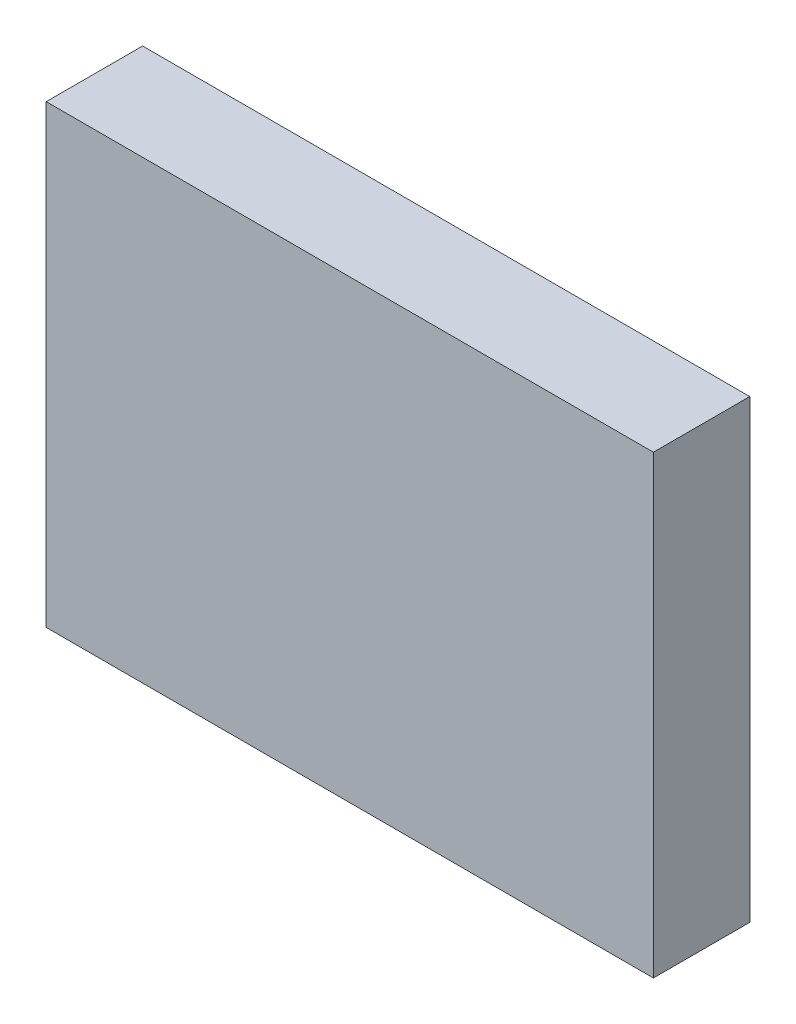
ISO-10303-21;
HEADER;
FILE_DESCRIPTION(('STEP AP214'),'2;1');
FILE_NAME('part.step','',(''),(''),'','','');
FILE_SCHEMA(('AUTOMOTIVE_DESIGN { 1 0 10303 214 1 1 1 1 }'));
ENDSEC;
DATA;
#1=APPLICATION_CONTEXT('core data for automotive mechanical design processes');
#2=APPLICATION_PROTOCOL_DEFINITION('international standard','automotive_design',2000,#1);
#3=PRODUCT_CONTEXT('',#1,'mechanical');
#4=PRODUCT('Part','Part','',(#3));
#5=PRODUCT_RELATED_PRODUCT_CATEGORY('part','',(#4));
#6=PRODUCT_DEFINITION_FORMATION('','',#4);
#7=PRODUCT_DEFINITION_CONTEXT('part definition',#1,'design');
#8=PRODUCT_DEFINITION('design','',#6,#7);
#9=PRODUCT_DEFINITION_SHAPE('','',#8);
#10=(LENGTH_UNIT() NAMED_UNIT(*) SI_UNIT(.MILLI.,.METRE.));
#11=(NAMED_UNIT(*) PLANE_ANGLE_UNIT() SI_UNIT($,.RADIAN.));
#12=(NAMED_UNIT(*) SI_UNIT($,.STERADIAN.) SOLID_ANGLE_UNIT());
#13=UNCERTAINTY_MEASURE_WITH_UNIT(LENGTH_MEASURE(1.E-05),#10,'distance_accuracy_value','');
#14=(GEOMETRIC_REPRESENTATION_CONTEXT(3) GLOBAL_UNCERTAINTY_ASSIGNED_CONTEXT((#13)) GLOBAL_UNIT_ASSIGNED_CONTEXT((#10,
#11,#12)) REPRESENTATION_CONTEXT('',''));
#15=CARTESIAN_POINT('',(0.,0.,0.));
#16=DIRECTION('',(0.,0.,1.));
#17=DIRECTION('',(1.,0.,0.));
#18=AXIS2_PLACEMENT_3D('',#15,#16,#17);
#19=CARTESIAN_POINT('',(-80.,-60.,25.4));
#20=DIRECTION('',(1.,0.,0.));
#21=DIRECTION('',(0.,0.,-1.));
#22=AXIS2_PLACEMENT_3D('',#19,#20,#21);
#23=PLANE('',#22);
#24=DIRECTION('',(0.,-1.,0.));
#25=VECTOR('',#24,1.);
#26=CARTESIAN_POINT('',(-80.,-60.,0.));
#27=LINE('',#26,#25);
#28=CARTESIAN_POINT('',(-80.,60.,0.));
#29=VERTEX_POINT('',#28);
#30=CARTESIAN_POINT('',(-80.,-60.,0.));
#31=VERTEX_POINT('',#30);
#32=EDGE_CURVE('E96',#29,#31,#27,.T.);
#33=ORIENTED_EDGE('',*,*,#32,.T.);
#34=DIRECTION('',(0.,0.,-1.));
#35=VECTOR('',#34,1.);
#36=CARTESIAN_POINT('',(-80.,-60.,25.4));
#37=LINE('',#36,#35);
#38=CARTESIAN_POINT('',(-80.,-60.,25.4));
#39=VERTEX_POINT('',#38);
#40=EDGE_CURVE('E11',#39,#31,#37,.T.);
#41=ORIENTED_EDGE('',*,*,#40,.F.);
#42=DIRECTION('',(0.,-1.,0.));
#43=VECTOR('',#42,1.);
#44=CARTESIAN_POINT('',(-80.,-60.,25.4));
#45=LINE('',#44,#43);
#46=CARTESIAN_POINT('',(-80.,60.,25.4));
#47=VERTEX_POINT('',#46);
#48=EDGE_CURVE('E84',#47,#39,#45,.T.);
#49=ORIENTED_EDGE('',*,*,#48,.F.);
#50=DIRECTION('',(0.,0.,-1.));
#51=VECTOR('',#50,1.);
#52=CARTESIAN_POINT('',(-80.,60.,25.4));
#53=LINE('',#52,#51);
#54=EDGE_CURVE('E92',#47,#29,#53,.T.);
#55=ORIENTED_EDGE('',*,*,#54,.T.);
#56=EDGE_LOOP('',(#33,#41,#49,#55));
#57=FACE_BOUND('',#56,.T.);
#58=ADVANCED_FACE('F33',(#57),#23,.F.);
#59=CARTESIAN_POINT('',(80.,-60.,25.4));
#60=DIRECTION('',(0.,1.,0.));
#61=DIRECTION('',(-1.,0.,0.));
#62=AXIS2_PLACEMENT_3D('',#59,#60,#61);
#63=PLANE('',#62);
#64=DIRECTION('',(1.,0.,0.));
#65=VECTOR('',#64,1.);
#66=CARTESIAN_POINT('',(80.,-60.,0.));
#67=LINE('',#66,#65);
#68=CARTESIAN_POINT('',(80.,-60.,0.));
#69=VERTEX_POINT('',#68);
#70=EDGE_CURVE('E88',#31,#69,#67,.T.);
#71=ORIENTED_EDGE('',*,*,#70,.T.);
#72=DIRECTION('',(0.,0.,-1.));
#73=VECTOR('',#72,1.);
#74=CARTESIAN_POINT('',(80.,-60.,25.4));
#75=LINE('',#74,#73);
#76=CARTESIAN_POINT('',(80.,-60.,25.4));
#77=VERTEX_POINT('',#76);
#78=EDGE_CURVE('E41',#77,#69,#75,.T.);
#79=ORIENTED_EDGE('',*,*,#78,.F.);
#80=DIRECTION('',(1.,0.,0.));
#81=VECTOR('',#80,1.);
#82=CARTESIAN_POINT('',(80.,-60.,25.4));
#83=LINE('',#82,#81);
#84=EDGE_CURVE('E79',#39,#77,#83,.T.);
#85=ORIENTED_EDGE('',*,*,#84,.F.);
#86=ORIENTED_EDGE('',*,*,#40,.T.);
#87=EDGE_LOOP('',(#71,#79,#85,#86));
#88=FACE_BOUND('',#87,.T.);
#89=ADVANCED_FACE('F87',(#88),#63,.F.);
#90=CARTESIAN_POINT('',(80.,-60.,25.4));
#91=DIRECTION('',(-1.,0.,0.));
#92=DIRECTION('',(0.,0.,1.));
#93=AXIS2_PLACEMENT_3D('',#90,#91,#92);
#94=PLANE('',#93);
#95=DIRECTION('',(0.,1.,0.));
#96=VECTOR('',#95,1.);
#97=CARTESIAN_POINT('',(80.,-60.,0.));
#98=LINE('',#97,#96);
#99=CARTESIAN_POINT('',(80.,60.,0.));
#100=VERTEX_POINT('',#99);
#101=EDGE_CURVE('E66',#69,#100,#98,.T.);
#102=ORIENTED_EDGE('',*,*,#101,.T.);
#103=DIRECTION('',(0.,0.,-1.));
#104=VECTOR('',#103,1.);
#105=CARTESIAN_POINT('',(80.,60.,25.4));
#106=LINE('',#105,#104);
#107=CARTESIAN_POINT('',(80.,60.,25.4));
#108=VERTEX_POINT('',#107);
#109=EDGE_CURVE('E89',#108,#100,#106,.T.);
#110=ORIENTED_EDGE('',*,*,#109,.F.);
#111=DIRECTION('',(0.,1.,0.));
#112=VECTOR('',#111,1.);
#113=CARTESIAN_POINT('',(80.,-60.,25.4));
#114=LINE('',#113,#112);
#115=EDGE_CURVE('E82',#77,#108,#114,.T.);
#116=ORIENTED_EDGE('',*,*,#115,.F.);
#117=ORIENTED_EDGE('',*,*,#78,.T.);
#118=EDGE_LOOP('',(#102,#110,#116,#117));
#119=FACE_BOUND('',#118,.T.);
#120=ADVANCED_FACE('F90',(#119),#94,.F.);
#121=CARTESIAN_POINT('',(80.,60.,25.4));
#122=DIRECTION('',(0.,-1.,0.));
#123=DIRECTION('',(1.,0.,0.));
#124=AXIS2_PLACEMENT_3D('',#121,#122,#123);
#125=PLANE('',#124);
#126=DIRECTION('',(-1.,0.,0.));
#127=VECTOR('',#126,1.);
#128=CARTESIAN_POINT('',(80.,60.,0.));
#129=LINE('',#128,#127);
#130=EDGE_CURVE('E72',#100,#29,#129,.T.);
#131=ORIENTED_EDGE('',*,*,#130,.T.);
#132=ORIENTED_EDGE('',*,*,#54,.F.);
#133=DIRECTION('',(-1.,0.,0.));
#134=VECTOR('',#133,1.);
#135=CARTESIAN_POINT('',(80.,60.,25.4));
#136=LINE('',#135,#134);
#137=EDGE_CURVE('E49',#108,#47,#136,.T.);
#138=ORIENTED_EDGE('',*,*,#137,.F.);
#139=ORIENTED_EDGE('',*,*,#109,.T.);
#140=EDGE_LOOP('',(#131,#132,#138,#139));
#141=FACE_BOUND('',#140,.T.);
#142=ADVANCED_FACE('F103',(#141),#125,.F.);
#143=CARTESIAN_POINT('',(0.,0.,25.4));
#144=DIRECTION('',(0.,0.,1.));
#145=DIRECTION('',(1.,0.,0.));
#146=AXIS2_PLACEMENT_3D('',#143,#144,#145);
#147=PLANE('',#146);
#148=ORIENTED_EDGE('',*,*,#48,.T.);
#149=ORIENTED_EDGE('',*,*,#84,.T.);
#150=ORIENTED_EDGE('',*,*,#115,.T.);
#151=ORIENTED_EDGE('',*,*,#137,.T.);
#152=EDGE_LOOP('',(#148,#149,#150,#151));
#153=FACE_BOUND('',#152,.T.);
#154=ADVANCED_FACE('F80',(#153),#147,.T.);
#155=CARTESIAN_POINT('',(0.,0.,0.));
#156=DIRECTION('',(0.,0.,1.));
#157=DIRECTION('',(1.,0.,0.));
#158=AXIS2_PLACEMENT_3D('',#155,#156,#157);
#159=PLANE('',#158);
#160=ORIENTED_EDGE('',*,*,#32,.F.);
#161=ORIENTED_EDGE('',*,*,#130,.F.);
#162=ORIENTED_EDGE('',*,*,#101,.F.);
#163=ORIENTED_EDGE('',*,*,#70,.F.);
#164=EDGE_LOOP('',(#160,#161,#162,#163));
#165=FACE_BOUND('',#164,.T.);
#166=ADVANCED_FACE('F106',(#165),#159,.F.);
#167=CLOSED_SHELL('',(#58,#89,#120,#142,#154,#166));
#168=MANIFOLD_SOLID_BREP('B2',#167);
#169=ADVANCED_BREP_SHAPE_REPRESENTATION('',(#18,#168),#14);
#170=SHAPE_DEFINITION_REPRESENTATION(#9,#169);
ENDSEC;
END-ISO-10303-21;
